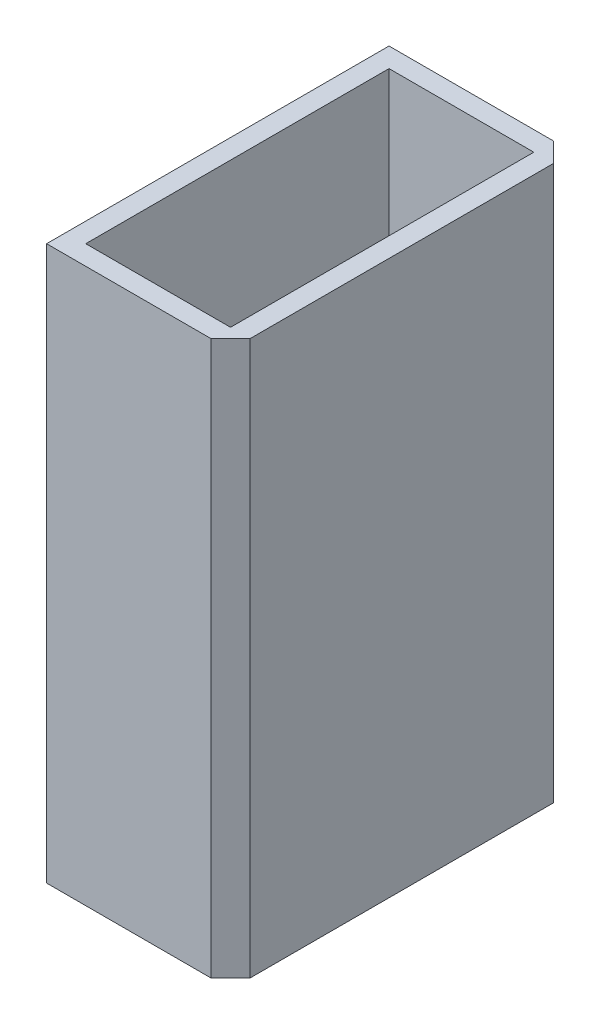
ISO-10303-21;
HEADER;
FILE_DESCRIPTION(('STEP AP214'),'2;1');
FILE_NAME('part.step','',(''),(''),'','','');
FILE_SCHEMA(('AUTOMOTIVE_DESIGN { 1 0 10303 214 1 1 1 1 }'));
ENDSEC;
DATA;
#1=APPLICATION_CONTEXT('core data for automotive mechanical design processes');
#2=APPLICATION_PROTOCOL_DEFINITION('international standard','automotive_design',2000,#1);
#3=PRODUCT_CONTEXT('',#1,'mechanical');
#4=PRODUCT('Part','Part','',(#3));
#5=PRODUCT_RELATED_PRODUCT_CATEGORY('part','',(#4));
#6=PRODUCT_DEFINITION_FORMATION('','',#4);
#7=PRODUCT_DEFINITION_CONTEXT('part definition',#1,'design');
#8=PRODUCT_DEFINITION('design','',#6,#7);
#9=PRODUCT_DEFINITION_SHAPE('','',#8);
#10=(LENGTH_UNIT() NAMED_UNIT(*) SI_UNIT(.MILLI.,.METRE.));
#11=(NAMED_UNIT(*) PLANE_ANGLE_UNIT() SI_UNIT($,.RADIAN.));
#12=(NAMED_UNIT(*) SI_UNIT($,.STERADIAN.) SOLID_ANGLE_UNIT());
#13=UNCERTAINTY_MEASURE_WITH_UNIT(LENGTH_MEASURE(1.E-05),#10,'distance_accuracy_value','');
#14=(GEOMETRIC_REPRESENTATION_CONTEXT(3) GLOBAL_UNCERTAINTY_ASSIGNED_CONTEXT((#13)) GLOBAL_UNIT_ASSIGNED_CONTEXT((#10,
#11,#12)) REPRESENTATION_CONTEXT('',''));
#15=CARTESIAN_POINT('',(0.,0.,0.));
#16=DIRECTION('',(0.,0.,1.));
#17=DIRECTION('',(1.,0.,0.));
#18=AXIS2_PLACEMENT_3D('',#15,#16,#17);
#19=CARTESIAN_POINT('',(0.,69.342,0.));
#20=DIRECTION('',(0.,-1.,0.));
#21=DIRECTION('',(0.,0.,-1.));
#22=AXIS2_PLACEMENT_3D('',#19,#20,#21);
#23=PLANE('',#22);
#24=DIRECTION('',(0.,0.,-1.));
#25=VECTOR('',#24,1.);
#26=CARTESIAN_POINT('',(21.336,69.342,2.54));
#27=LINE('',#26,#25);
#28=CARTESIAN_POINT('',(21.336,69.342,0.));
#29=VERTEX_POINT('',#28);
#30=CARTESIAN_POINT('',(21.336,69.342,-39.37));
#31=VERTEX_POINT('',#30);
#32=EDGE_CURVE('E180',#29,#31,#27,.T.);
#33=ORIENTED_EDGE('',*,*,#32,.T.);
#34=DIRECTION('',(0.707106781186547,0.,0.707106781186548));
#35=VECTOR('',#34,1.);
#36=CARTESIAN_POINT('',(18.796,69.342,-41.91));
#37=LINE('',#36,#35);
#38=CARTESIAN_POINT('',(18.796,69.342,-41.91));
#39=VERTEX_POINT('',#38);
#40=EDGE_CURVE('E48',#31,#39,#37,.F.);
#41=ORIENTED_EDGE('',*,*,#40,.T.);
#42=DIRECTION('',(-1.,0.,0.));
#43=VECTOR('',#42,1.);
#44=CARTESIAN_POINT('',(-2.54,69.342,-41.91));
#45=LINE('',#44,#43);
#46=CARTESIAN_POINT('',(-2.54,69.342,-41.91));
#47=VERTEX_POINT('',#46);
#48=EDGE_CURVE('E182',#39,#47,#45,.T.);
#49=ORIENTED_EDGE('',*,*,#48,.T.);
#50=DIRECTION('',(0.,0.,1.));
#51=VECTOR('',#50,1.);
#52=CARTESIAN_POINT('',(-2.54,69.342,2.54));
#53=LINE('',#52,#51);
#54=CARTESIAN_POINT('',(-2.54,69.342,2.54));
#55=VERTEX_POINT('',#54);
#56=EDGE_CURVE('E177',#47,#55,#53,.T.);
#57=ORIENTED_EDGE('',*,*,#56,.T.);
#58=DIRECTION('',(1.,0.,0.));
#59=VECTOR('',#58,1.);
#60=CARTESIAN_POINT('',(-2.54,69.342,2.54));
#61=LINE('',#60,#59);
#62=CARTESIAN_POINT('',(18.796,69.342,2.54));
#63=VERTEX_POINT('',#62);
#64=EDGE_CURVE('E131',#55,#63,#61,.T.);
#65=ORIENTED_EDGE('',*,*,#64,.T.);
#66=DIRECTION('',(-0.70710678118655,0.,0.707106781186545));
#67=VECTOR('',#66,1.);
#68=CARTESIAN_POINT('',(21.336,69.342,0.));
#69=LINE('',#68,#67);
#70=EDGE_CURVE('E194',#63,#29,#69,.F.);
#71=ORIENTED_EDGE('',*,*,#70,.T.);
#72=EDGE_LOOP('',(#33,#41,#49,#57,#65,#71));
#73=FACE_BOUND('',#72,.T.);
#74=DIRECTION('',(0.,0.,1.));
#75=VECTOR('',#74,1.);
#76=CARTESIAN_POINT('',(0.,69.342,0.));
#77=LINE('',#76,#75);
#78=CARTESIAN_POINT('',(0.,69.342,-39.37));
#79=VERTEX_POINT('',#78);
#80=CARTESIAN_POINT('',(0.,69.342,0.));
#81=VERTEX_POINT('',#80);
#82=EDGE_CURVE('E146',#79,#81,#77,.T.);
#83=ORIENTED_EDGE('',*,*,#82,.F.);
#84=DIRECTION('',(-1.,0.,0.));
#85=VECTOR('',#84,1.);
#86=CARTESIAN_POINT('',(0.,69.342,-39.37));
#87=LINE('',#86,#85);
#88=CARTESIAN_POINT('',(18.796,69.342,-39.37));
#89=VERTEX_POINT('',#88);
#90=EDGE_CURVE('E154',#89,#79,#87,.T.);
#91=ORIENTED_EDGE('',*,*,#90,.F.);
#92=DIRECTION('',(0.,0.,-1.));
#93=VECTOR('',#92,1.);
#94=CARTESIAN_POINT('',(18.796,69.342,0.));
#95=LINE('',#94,#93);
#96=CARTESIAN_POINT('',(18.796,69.342,0.));
#97=VERTEX_POINT('',#96);
#98=EDGE_CURVE('E151',#97,#89,#95,.T.);
#99=ORIENTED_EDGE('',*,*,#98,.F.);
#100=DIRECTION('',(1.,0.,0.));
#101=VECTOR('',#100,1.);
#102=CARTESIAN_POINT('',(0.,69.342,0.));
#103=LINE('',#102,#101);
#104=EDGE_CURVE('E148',#81,#97,#103,.T.);
#105=ORIENTED_EDGE('',*,*,#104,.F.);
#106=EDGE_LOOP('',(#83,#91,#99,#105));
#107=FACE_BOUND('',#106,.T.);
#108=ADVANCED_FACE('F39',(#73,#107),#23,.F.);
#109=CARTESIAN_POINT('',(-2.54,69.342,2.54));
#110=DIRECTION('',(1.,0.,0.));
#111=DIRECTION('',(0.,0.,-1.));
#112=AXIS2_PLACEMENT_3D('',#109,#110,#111);
#113=PLANE('',#112);
#114=DIRECTION('',(0.,-1.,0.));
#115=VECTOR('',#114,1.);
#116=CARTESIAN_POINT('',(-2.54,69.342,-41.91));
#117=LINE('',#116,#115);
#118=CARTESIAN_POINT('',(-2.54,-2.54,-41.91));
#119=VERTEX_POINT('',#118);
#120=EDGE_CURVE('E136',#47,#119,#117,.T.);
#121=ORIENTED_EDGE('',*,*,#120,.T.);
#122=DIRECTION('',(0.,0.,-1.));
#123=VECTOR('',#122,1.);
#124=CARTESIAN_POINT('',(-2.54,-2.54,-41.91));
#125=LINE('',#124,#123);
#126=CARTESIAN_POINT('',(-2.54,-2.54,2.54));
#127=VERTEX_POINT('',#126);
#128=EDGE_CURVE('E122',#127,#119,#125,.T.);
#129=ORIENTED_EDGE('',*,*,#128,.F.);
#130=DIRECTION('',(0.,-1.,0.));
#131=VECTOR('',#130,1.);
#132=CARTESIAN_POINT('',(-2.54,69.342,2.54));
#133=LINE('',#132,#131);
#134=EDGE_CURVE('E129',#55,#127,#133,.T.);
#135=ORIENTED_EDGE('',*,*,#134,.F.);
#136=ORIENTED_EDGE('',*,*,#56,.F.);
#137=EDGE_LOOP('',(#121,#129,#135,#136));
#138=FACE_BOUND('',#137,.T.);
#139=ADVANCED_FACE('F138',(#138),#113,.F.);
#140=CARTESIAN_POINT('',(-2.54,69.342,2.54));
#141=DIRECTION('',(0.,0.,-1.));
#142=DIRECTION('',(-1.,0.,0.));
#143=AXIS2_PLACEMENT_3D('',#140,#141,#142);
#144=PLANE('',#143);
#145=DIRECTION('',(-1.,0.,0.));
#146=VECTOR('',#145,1.);
#147=CARTESIAN_POINT('',(21.336,-2.54,2.54));
#148=LINE('',#147,#146);
#149=CARTESIAN_POINT('',(18.796,-2.54,2.54));
#150=VERTEX_POINT('',#149);
#151=EDGE_CURVE('E117',#150,#127,#148,.T.);
#152=ORIENTED_EDGE('',*,*,#151,.F.);
#153=DIRECTION('',(0.,1.,0.));
#154=VECTOR('',#153,1.);
#155=CARTESIAN_POINT('',(18.796,69.342,2.54));
#156=LINE('',#155,#154);
#157=EDGE_CURVE('E11',#150,#63,#156,.T.);
#158=ORIENTED_EDGE('',*,*,#157,.T.);
#159=ORIENTED_EDGE('',*,*,#64,.F.);
#160=ORIENTED_EDGE('',*,*,#134,.T.);
#161=EDGE_LOOP('',(#152,#158,#159,#160));
#162=FACE_BOUND('',#161,.T.);
#163=ADVANCED_FACE('F130',(#162),#144,.F.);
#164=CARTESIAN_POINT('',(21.336,69.342,2.54));
#165=DIRECTION('',(-1.,0.,0.));
#166=DIRECTION('',(0.,0.,1.));
#167=AXIS2_PLACEMENT_3D('',#164,#165,#166);
#168=PLANE('',#167);
#169=DIRECTION('',(0.,0.,1.));
#170=VECTOR('',#169,1.);
#171=CARTESIAN_POINT('',(21.336,-2.54,-41.91));
#172=LINE('',#171,#170);
#173=CARTESIAN_POINT('',(21.336,-2.54,-39.37));
#174=VERTEX_POINT('',#173);
#175=CARTESIAN_POINT('',(21.336,-2.54,0.));
#176=VERTEX_POINT('',#175);
#177=EDGE_CURVE('E126',#174,#176,#172,.T.);
#178=ORIENTED_EDGE('',*,*,#177,.F.);
#179=DIRECTION('',(0.,1.,0.));
#180=VECTOR('',#179,1.);
#181=CARTESIAN_POINT('',(21.336,69.342,-39.37));
#182=LINE('',#181,#180);
#183=EDGE_CURVE('E61',#174,#31,#182,.T.);
#184=ORIENTED_EDGE('',*,*,#183,.T.);
#185=ORIENTED_EDGE('',*,*,#32,.F.);
#186=DIRECTION('',(0.,-1.,0.));
#187=VECTOR('',#186,1.);
#188=CARTESIAN_POINT('',(21.336,69.342,0.));
#189=LINE('',#188,#187);
#190=EDGE_CURVE('E190',#29,#176,#189,.T.);
#191=ORIENTED_EDGE('',*,*,#190,.T.);
#192=EDGE_LOOP('',(#178,#184,#185,#191));
#193=FACE_BOUND('',#192,.T.);
#194=ADVANCED_FACE('F204',(#193),#168,.F.);
#195=CARTESIAN_POINT('',(-2.54,69.342,-41.91));
#196=DIRECTION('',(0.,0.,1.));
#197=DIRECTION('',(1.,0.,0.));
#198=AXIS2_PLACEMENT_3D('',#195,#196,#197);
#199=PLANE('',#198);
#200=ORIENTED_EDGE('',*,*,#48,.F.);
#201=DIRECTION('',(0.,-1.,0.));
#202=VECTOR('',#201,1.);
#203=CARTESIAN_POINT('',(18.796,69.342,-41.91));
#204=LINE('',#203,#202);
#205=CARTESIAN_POINT('',(18.796,-2.54,-41.91));
#206=VERTEX_POINT('',#205);
#207=EDGE_CURVE('E135',#39,#206,#204,.T.);
#208=ORIENTED_EDGE('',*,*,#207,.T.);
#209=DIRECTION('',(1.,0.,0.));
#210=VECTOR('',#209,1.);
#211=CARTESIAN_POINT('',(21.336,-2.54,-41.91));
#212=LINE('',#211,#210);
#213=EDGE_CURVE('E140',#119,#206,#212,.T.);
#214=ORIENTED_EDGE('',*,*,#213,.F.);
#215=ORIENTED_EDGE('',*,*,#120,.F.);
#216=EDGE_LOOP('',(#200,#208,#214,#215));
#217=FACE_BOUND('',#216,.T.);
#218=ADVANCED_FACE('F202',(#217),#199,.F.);
#219=CARTESIAN_POINT('',(0.,69.342,0.));
#220=DIRECTION('',(1.,0.,0.));
#221=DIRECTION('',(0.,0.,-1.));
#222=AXIS2_PLACEMENT_3D('',#219,#220,#221);
#223=PLANE('',#222);
#224=DIRECTION('',(0.,0.,1.));
#225=VECTOR('',#224,1.);
#226=CARTESIAN_POINT('',(0.,0.,0.));
#227=LINE('',#226,#225);
#228=CARTESIAN_POINT('',(0.,0.,-39.37));
#229=VERTEX_POINT('',#228);
#230=CARTESIAN_POINT('',(0.,0.,0.));
#231=VERTEX_POINT('',#230);
#232=EDGE_CURVE('E142',#229,#231,#227,.T.);
#233=ORIENTED_EDGE('',*,*,#232,.F.);
#234=DIRECTION('',(0.,-1.,0.));
#235=VECTOR('',#234,1.);
#236=CARTESIAN_POINT('',(0.,69.342,-39.37));
#237=LINE('',#236,#235);
#238=EDGE_CURVE('E156',#79,#229,#237,.T.);
#239=ORIENTED_EDGE('',*,*,#238,.F.);
#240=ORIENTED_EDGE('',*,*,#82,.T.);
#241=DIRECTION('',(0.,-1.,0.));
#242=VECTOR('',#241,1.);
#243=CARTESIAN_POINT('',(0.,69.342,0.));
#244=LINE('',#243,#242);
#245=EDGE_CURVE('E174',#81,#231,#244,.T.);
#246=ORIENTED_EDGE('',*,*,#245,.T.);
#247=EDGE_LOOP('',(#233,#239,#240,#246));
#248=FACE_BOUND('',#247,.T.);
#249=ADVANCED_FACE('F220',(#248),#223,.T.);
#250=CARTESIAN_POINT('',(0.,69.342,0.));
#251=DIRECTION('',(0.,0.,-1.));
#252=DIRECTION('',(-1.,0.,0.));
#253=AXIS2_PLACEMENT_3D('',#250,#251,#252);
#254=PLANE('',#253);
#255=DIRECTION('',(1.,0.,0.));
#256=VECTOR('',#255,1.);
#257=CARTESIAN_POINT('',(0.,0.,0.));
#258=LINE('',#257,#256);
#259=CARTESIAN_POINT('',(18.796,0.,0.));
#260=VERTEX_POINT('',#259);
#261=EDGE_CURVE('E159',#231,#260,#258,.T.);
#262=ORIENTED_EDGE('',*,*,#261,.F.);
#263=ORIENTED_EDGE('',*,*,#245,.F.);
#264=ORIENTED_EDGE('',*,*,#104,.T.);
#265=DIRECTION('',(0.,-1.,0.));
#266=VECTOR('',#265,1.);
#267=CARTESIAN_POINT('',(18.796,69.342,0.));
#268=LINE('',#267,#266);
#269=EDGE_CURVE('E172',#97,#260,#268,.T.);
#270=ORIENTED_EDGE('',*,*,#269,.T.);
#271=EDGE_LOOP('',(#262,#263,#264,#270));
#272=FACE_BOUND('',#271,.T.);
#273=ADVANCED_FACE('F251',(#272),#254,.T.);
#274=CARTESIAN_POINT('',(18.796,69.342,0.));
#275=DIRECTION('',(-1.,0.,0.));
#276=DIRECTION('',(0.,0.,1.));
#277=AXIS2_PLACEMENT_3D('',#274,#275,#276);
#278=PLANE('',#277);
#279=DIRECTION('',(0.,0.,-1.));
#280=VECTOR('',#279,1.);
#281=CARTESIAN_POINT('',(18.796,0.,0.));
#282=LINE('',#281,#280);
#283=CARTESIAN_POINT('',(18.796,0.,-39.37));
#284=VERTEX_POINT('',#283);
#285=EDGE_CURVE('E162',#260,#284,#282,.T.);
#286=ORIENTED_EDGE('',*,*,#285,.F.);
#287=ORIENTED_EDGE('',*,*,#269,.F.);
#288=ORIENTED_EDGE('',*,*,#98,.T.);
#289=DIRECTION('',(0.,-1.,0.));
#290=VECTOR('',#289,1.);
#291=CARTESIAN_POINT('',(18.796,69.342,-39.37));
#292=LINE('',#291,#290);
#293=EDGE_CURVE('E169',#89,#284,#292,.T.);
#294=ORIENTED_EDGE('',*,*,#293,.T.);
#295=EDGE_LOOP('',(#286,#287,#288,#294));
#296=FACE_BOUND('',#295,.T.);
#297=ADVANCED_FACE('F258',(#296),#278,.T.);
#298=CARTESIAN_POINT('',(0.,69.342,-39.37));
#299=DIRECTION('',(0.,0.,1.));
#300=DIRECTION('',(1.,0.,0.));
#301=AXIS2_PLACEMENT_3D('',#298,#299,#300);
#302=PLANE('',#301);
#303=DIRECTION('',(-1.,0.,0.));
#304=VECTOR('',#303,1.);
#305=CARTESIAN_POINT('',(0.,0.,-39.37));
#306=LINE('',#305,#304);
#307=EDGE_CURVE('E149',#284,#229,#306,.T.);
#308=ORIENTED_EDGE('',*,*,#307,.F.);
#309=ORIENTED_EDGE('',*,*,#293,.F.);
#310=ORIENTED_EDGE('',*,*,#90,.T.);
#311=ORIENTED_EDGE('',*,*,#238,.T.);
#312=EDGE_LOOP('',(#308,#309,#310,#311));
#313=FACE_BOUND('',#312,.T.);
#314=ADVANCED_FACE('F265',(#313),#302,.T.);
#315=CARTESIAN_POINT('',(0.,0.,0.));
#316=DIRECTION('',(0.,-1.,0.));
#317=DIRECTION('',(0.,0.,-1.));
#318=AXIS2_PLACEMENT_3D('',#315,#316,#317);
#319=PLANE('',#318);
#320=ORIENTED_EDGE('',*,*,#285,.T.);
#321=ORIENTED_EDGE('',*,*,#307,.T.);
#322=ORIENTED_EDGE('',*,*,#232,.T.);
#323=ORIENTED_EDGE('',*,*,#261,.T.);
#324=EDGE_LOOP('',(#320,#321,#322,#323));
#325=FACE_BOUND('',#324,.T.);
#326=ADVANCED_FACE('F273',(#325),#319,.F.);
#327=CARTESIAN_POINT('',(0.,-2.54,0.));
#328=DIRECTION('',(0.,-1.,0.));
#329=DIRECTION('',(0.,0.,-1.));
#330=AXIS2_PLACEMENT_3D('',#327,#328,#329);
#331=PLANE('',#330);
#332=ORIENTED_EDGE('',*,*,#213,.T.);
#333=DIRECTION('',(-0.707106781186547,0.,-0.707106781186548));
#334=VECTOR('',#333,1.);
#335=CARTESIAN_POINT('',(30.353,-2.54,-30.3529999999999));
#336=LINE('',#335,#334);
#337=EDGE_CURVE('E188',#206,#174,#336,.F.);
#338=ORIENTED_EDGE('',*,*,#337,.T.);
#339=ORIENTED_EDGE('',*,*,#177,.T.);
#340=DIRECTION('',(0.70710678118655,0.,-0.707106781186545));
#341=VECTOR('',#340,1.);
#342=CARTESIAN_POINT('',(10.6679999999999,-2.54,10.668));
#343=LINE('',#342,#341);
#344=EDGE_CURVE('E125',#176,#150,#343,.F.);
#345=ORIENTED_EDGE('',*,*,#344,.T.);
#346=ORIENTED_EDGE('',*,*,#151,.T.);
#347=ORIENTED_EDGE('',*,*,#128,.T.);
#348=EDGE_LOOP('',(#332,#338,#339,#345,#346,#347));
#349=FACE_BOUND('',#348,.T.);
#350=ADVANCED_FACE('F120',(#349),#331,.T.);
#351=CARTESIAN_POINT('',(18.796,69.342,-41.91));
#352=DIRECTION('',(-0.707106781186548,0.,0.707106781186547));
#353=DIRECTION('',(0.,-1.,0.));
#354=AXIS2_PLACEMENT_3D('',#351,#352,#353);
#355=PLANE('',#354);
#356=ORIENTED_EDGE('',*,*,#40,.F.);
#357=ORIENTED_EDGE('',*,*,#183,.F.);
#358=ORIENTED_EDGE('',*,*,#337,.F.);
#359=ORIENTED_EDGE('',*,*,#207,.F.);
#360=EDGE_LOOP('',(#356,#357,#358,#359));
#361=FACE_BOUND('',#360,.T.);
#362=ADVANCED_FACE('F203',(#361),#355,.F.);
#363=CARTESIAN_POINT('',(21.336,69.342,0.));
#364=DIRECTION('',(-0.707106781186545,0.,-0.70710678118655));
#365=DIRECTION('',(0.,-1.,0.));
#366=AXIS2_PLACEMENT_3D('',#363,#364,#365);
#367=PLANE('',#366);
#368=ORIENTED_EDGE('',*,*,#70,.F.);
#369=ORIENTED_EDGE('',*,*,#157,.F.);
#370=ORIENTED_EDGE('',*,*,#344,.F.);
#371=ORIENTED_EDGE('',*,*,#190,.F.);
#372=EDGE_LOOP('',(#368,#369,#370,#371));
#373=FACE_BOUND('',#372,.T.);
#374=ADVANCED_FACE('F42',(#373),#367,.F.);
#375=CLOSED_SHELL('',(#108,#139,#163,#194,#218,#249,#273,#297,#314,#326,#350,#362,#374));
#376=MANIFOLD_SOLID_BREP('B2',#375);
#377=ADVANCED_BREP_SHAPE_REPRESENTATION('',(#18,#376),#14);
#378=SHAPE_DEFINITION_REPRESENTATION(#9,#377);
ENDSEC;
END-ISO-10303-21;
